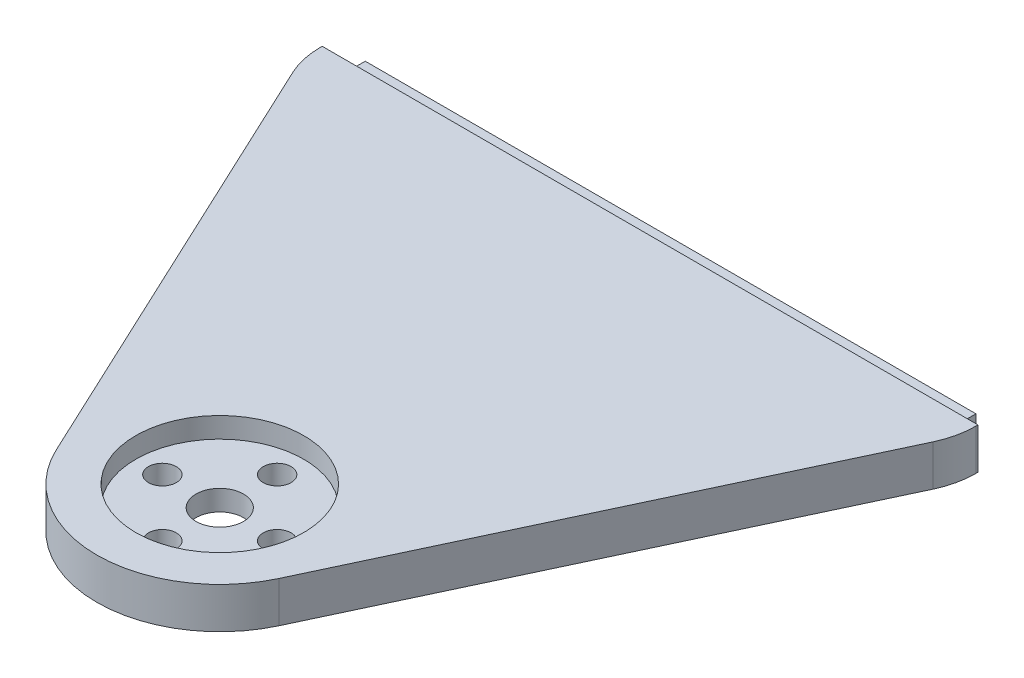
ISO-10303-21;
HEADER;
FILE_DESCRIPTION(('STEP AP214'),'2;1');
FILE_NAME('part.step','',(''),(''),'','','');
FILE_SCHEMA(('AUTOMOTIVE_DESIGN { 1 0 10303 214 1 1 1 1 }'));
ENDSEC;
DATA;
#1=APPLICATION_CONTEXT('core data for automotive mechanical design processes');
#2=APPLICATION_PROTOCOL_DEFINITION('international standard','automotive_design',2000,#1);
#3=PRODUCT_CONTEXT('',#1,'mechanical');
#4=PRODUCT('Part','Part','',(#3));
#5=PRODUCT_RELATED_PRODUCT_CATEGORY('part','',(#4));
#6=PRODUCT_DEFINITION_FORMATION('','',#4);
#7=PRODUCT_DEFINITION_CONTEXT('part definition',#1,'design');
#8=PRODUCT_DEFINITION('design','',#6,#7);
#9=PRODUCT_DEFINITION_SHAPE('','',#8);
#10=(LENGTH_UNIT() NAMED_UNIT(*) SI_UNIT(.MILLI.,.METRE.));
#11=(NAMED_UNIT(*) PLANE_ANGLE_UNIT() SI_UNIT($,.RADIAN.));
#12=(NAMED_UNIT(*) SI_UNIT($,.STERADIAN.) SOLID_ANGLE_UNIT());
#13=UNCERTAINTY_MEASURE_WITH_UNIT(LENGTH_MEASURE(1.E-05),#10,'distance_accuracy_value','');
#14=(GEOMETRIC_REPRESENTATION_CONTEXT(3) GLOBAL_UNCERTAINTY_ASSIGNED_CONTEXT((#13)) GLOBAL_UNIT_ASSIGNED_CONTEXT((#10,
#11,#12)) REPRESENTATION_CONTEXT('',''));
#15=CARTESIAN_POINT('',(0.,0.,0.));
#16=DIRECTION('',(0.,0.,1.));
#17=DIRECTION('',(1.,0.,0.));
#18=AXIS2_PLACEMENT_3D('',#15,#16,#17);
#19=CARTESIAN_POINT('',(0.,5.,50.));
#20=DIRECTION('',(0.,-1.,0.));
#21=DIRECTION('',(0.,0.,-1.));
#22=AXIS2_PLACEMENT_3D('',#19,#20,#21);
#23=CYLINDRICAL_SURFACE('',#22,2.9);
#24=CARTESIAN_POINT('',(0.,0.,50.));
#25=DIRECTION('',(0.,-1.,0.));
#26=DIRECTION('',(0.,0.,-1.));
#27=AXIS2_PLACEMENT_3D('',#24,#25,#26);
#28=CIRCLE('',#27,2.9);
#29=CARTESIAN_POINT('',(0.,0.,47.1));
#30=VERTEX_POINT('',#29);
#31=EDGE_CURVE('E165',#30,#30,#28,.T.);
#32=ORIENTED_EDGE('',*,*,#31,.T.);
#33=EDGE_LOOP('',(#32));
#34=FACE_BOUND('',#33,.T.);
#35=CARTESIAN_POINT('',(0.,2.5,50.));
#36=DIRECTION('',(0.,1.,0.));
#37=DIRECTION('',(0.,0.,1.));
#38=AXIS2_PLACEMENT_3D('',#35,#36,#37);
#39=CIRCLE('',#38,2.9);
#40=CARTESIAN_POINT('',(0.,2.5,52.9));
#41=VERTEX_POINT('',#40);
#42=EDGE_CURVE('E413',#41,#41,#39,.F.);
#43=ORIENTED_EDGE('',*,*,#42,.F.);
#44=EDGE_LOOP('',(#43));
#45=FACE_BOUND('',#44,.T.);
#46=ADVANCED_FACE('F39',(#34,#45),#23,.F.);
#47=CARTESIAN_POINT('',(0.,0.,57.));
#48=DIRECTION('',(0.,1.,0.));
#49=DIRECTION('',(0.,0.,1.));
#50=AXIS2_PLACEMENT_3D('',#47,#48,#49);
#51=CYLINDRICAL_SURFACE('',#50,1.7);
#52=CARTESIAN_POINT('',(0.,0.,57.));
#53=DIRECTION('',(0.,1.,0.));
#54=DIRECTION('',(0.,0.,1.));
#55=AXIS2_PLACEMENT_3D('',#52,#53,#54);
#56=CIRCLE('',#55,1.7);
#57=CARTESIAN_POINT('',(0.,0.,58.7));
#58=VERTEX_POINT('',#57);
#59=EDGE_CURVE('E425',#58,#58,#56,.T.);
#60=ORIENTED_EDGE('',*,*,#59,.F.);
#61=EDGE_LOOP('',(#60));
#62=FACE_BOUND('',#61,.T.);
#63=CARTESIAN_POINT('',(0.,2.5,57.));
#64=DIRECTION('',(0.,1.,0.));
#65=DIRECTION('',(0.,0.,1.));
#66=AXIS2_PLACEMENT_3D('',#63,#64,#65);
#67=CIRCLE('',#66,1.7);
#68=CARTESIAN_POINT('',(0.,2.5,58.7));
#69=VERTEX_POINT('',#68);
#70=EDGE_CURVE('E415',#69,#69,#67,.F.);
#71=ORIENTED_EDGE('',*,*,#70,.F.);
#72=EDGE_LOOP('',(#71));
#73=FACE_BOUND('',#72,.T.);
#74=ADVANCED_FACE('F271',(#62,#73),#51,.F.);
#75=CARTESIAN_POINT('',(7.,0.,50.0000000000001));
#76=DIRECTION('',(0.,1.,0.));
#77=DIRECTION('',(0.,0.,1.));
#78=AXIS2_PLACEMENT_3D('',#75,#76,#77);
#79=CYLINDRICAL_SURFACE('',#78,1.7);
#80=CARTESIAN_POINT('',(7.,0.,50.0000000000001));
#81=DIRECTION('',(0.,1.,0.));
#82=DIRECTION('',(1.,0.,0.));
#83=AXIS2_PLACEMENT_3D('',#80,#81,#82);
#84=CIRCLE('',#83,1.7);
#85=CARTESIAN_POINT('',(8.7,0.,50.0000000000001));
#86=VERTEX_POINT('',#85);
#87=EDGE_CURVE('E416',#86,#86,#84,.T.);
#88=ORIENTED_EDGE('',*,*,#87,.F.);
#89=EDGE_LOOP('',(#88));
#90=FACE_BOUND('',#89,.T.);
#91=CARTESIAN_POINT('',(7.,2.5,50.0000000000001));
#92=DIRECTION('',(0.,1.,0.));
#93=DIRECTION('',(0.,0.,1.));
#94=AXIS2_PLACEMENT_3D('',#91,#92,#93);
#95=CIRCLE('',#94,1.7);
#96=CARTESIAN_POINT('',(7.,2.5,51.7000000000001));
#97=VERTEX_POINT('',#96);
#98=EDGE_CURVE('E408',#97,#97,#95,.F.);
#99=ORIENTED_EDGE('',*,*,#98,.F.);
#100=EDGE_LOOP('',(#99));
#101=FACE_BOUND('',#100,.T.);
#102=ADVANCED_FACE('F280',(#90,#101),#79,.F.);
#103=CARTESIAN_POINT('',(0.,0.,43.));
#104=DIRECTION('',(0.,1.,0.));
#105=DIRECTION('',(0.,0.,1.));
#106=AXIS2_PLACEMENT_3D('',#103,#104,#105);
#107=CYLINDRICAL_SURFACE('',#106,1.7);
#108=CARTESIAN_POINT('',(0.,0.,43.));
#109=DIRECTION('',(0.,1.,0.));
#110=DIRECTION('',(0.,0.,-1.));
#111=AXIS2_PLACEMENT_3D('',#108,#109,#110);
#112=CIRCLE('',#111,1.7);
#113=CARTESIAN_POINT('',(0.,0.,41.3));
#114=VERTEX_POINT('',#113);
#115=EDGE_CURVE('E421',#114,#114,#112,.T.);
#116=ORIENTED_EDGE('',*,*,#115,.F.);
#117=EDGE_LOOP('',(#116));
#118=FACE_BOUND('',#117,.T.);
#119=CARTESIAN_POINT('',(0.,2.5,43.));
#120=DIRECTION('',(0.,1.,0.));
#121=DIRECTION('',(0.,0.,1.));
#122=AXIS2_PLACEMENT_3D('',#119,#120,#121);
#123=CIRCLE('',#122,1.7);
#124=CARTESIAN_POINT('',(0.,2.5,44.7));
#125=VERTEX_POINT('',#124);
#126=EDGE_CURVE('E406',#125,#125,#123,.F.);
#127=ORIENTED_EDGE('',*,*,#126,.F.);
#128=EDGE_LOOP('',(#127));
#129=FACE_BOUND('',#128,.T.);
#130=ADVANCED_FACE('F353',(#118,#129),#107,.F.);
#131=CARTESIAN_POINT('',(-7.,0.,50.));
#132=DIRECTION('',(0.,1.,0.));
#133=DIRECTION('',(0.,0.,1.));
#134=AXIS2_PLACEMENT_3D('',#131,#132,#133);
#135=CYLINDRICAL_SURFACE('',#134,1.7);
#136=CARTESIAN_POINT('',(-7.,0.,50.));
#137=DIRECTION('',(0.,1.,0.));
#138=DIRECTION('',(-1.,0.,0.));
#139=AXIS2_PLACEMENT_3D('',#136,#137,#138);
#140=CIRCLE('',#139,1.7);
#141=CARTESIAN_POINT('',(-8.7,0.,50.));
#142=VERTEX_POINT('',#141);
#143=EDGE_CURVE('E420',#142,#142,#140,.T.);
#144=ORIENTED_EDGE('',*,*,#143,.F.);
#145=EDGE_LOOP('',(#144));
#146=FACE_BOUND('',#145,.T.);
#147=CARTESIAN_POINT('',(-7.,2.5,50.));
#148=DIRECTION('',(0.,1.,0.));
#149=DIRECTION('',(0.,0.,1.));
#150=AXIS2_PLACEMENT_3D('',#147,#148,#149);
#151=CIRCLE('',#150,1.7);
#152=CARTESIAN_POINT('',(-7.,2.5,51.7));
#153=VERTEX_POINT('',#152);
#154=EDGE_CURVE('E43',#153,#153,#151,.F.);
#155=ORIENTED_EDGE('',*,*,#154,.F.);
#156=EDGE_LOOP('',(#155));
#157=FACE_BOUND('',#156,.T.);
#158=ADVANCED_FACE('F309',(#146,#157),#135,.F.);
#159=CARTESIAN_POINT('',(0.,0.,50.));
#160=DIRECTION('',(0.,1.,0.));
#161=DIRECTION('',(0.,0.,1.));
#162=AXIS2_PLACEMENT_3D('',#159,#160,#161);
#163=PLANE('',#162);
#164=ORIENTED_EDGE('',*,*,#143,.T.);
#165=EDGE_LOOP('',(#164));
#166=FACE_BOUND('',#165,.T.);
#167=ORIENTED_EDGE('',*,*,#115,.T.);
#168=EDGE_LOOP('',(#167));
#169=FACE_BOUND('',#168,.T.);
#170=ORIENTED_EDGE('',*,*,#87,.T.);
#171=EDGE_LOOP('',(#170));
#172=FACE_BOUND('',#171,.T.);
#173=ORIENTED_EDGE('',*,*,#59,.T.);
#174=EDGE_LOOP('',(#173));
#175=FACE_BOUND('',#174,.T.);
#176=ORIENTED_EDGE('',*,*,#31,.F.);
#177=EDGE_LOOP('',(#176));
#178=FACE_BOUND('',#177,.T.);
#179=DIRECTION('',(0.424385346243353,0.,0.905481682804191));
#180=VECTOR('',#179,1.);
#181=CARTESIAN_POINT('',(-40.,0.,0.));
#182=LINE('',#181,#180);
#183=CARTESIAN_POINT('',(-39.0548168280419,0.,2.0166720097165));
#184=VERTEX_POINT('',#183);
#185=CARTESIAN_POINT('',(-13.5822252420629,0.,56.3657801936503));
#186=VERTEX_POINT('',#185);
#187=EDGE_CURVE('E200',#184,#186,#182,.T.);
#188=ORIENTED_EDGE('',*,*,#187,.F.);
#189=CARTESIAN_POINT('',(-30.,0.,-2.22718145271703));
#190=DIRECTION('',(0.,1.,0.));
#191=DIRECTION('',(0.,0.,1.));
#192=AXIS2_PLACEMENT_3D('',#189,#190,#191);
#193=CIRCLE('',#192,10.);
#194=CARTESIAN_POINT('',(-40.,0.,-2.22718145271703));
#195=VERTEX_POINT('',#194);
#196=EDGE_CURVE('E219',#184,#195,#193,.F.);
#197=ORIENTED_EDGE('',*,*,#196,.T.);
#198=DIRECTION('',(0.,0.,1.));
#199=VECTOR('',#198,1.);
#200=CARTESIAN_POINT('',(-40.,0.,-5.));
#201=LINE('',#200,#199);
#202=CARTESIAN_POINT('',(-40.,0.,-2.5));
#203=VERTEX_POINT('',#202);
#204=EDGE_CURVE('E188',#203,#195,#201,.T.);
#205=ORIENTED_EDGE('',*,*,#204,.F.);
#206=DIRECTION('',(-1.,0.,0.));
#207=VECTOR('',#206,1.);
#208=CARTESIAN_POINT('',(40.,0.,-2.5));
#209=LINE('',#208,#207);
#210=CARTESIAN_POINT('',(40.,0.,-2.5));
#211=VERTEX_POINT('',#210);
#212=EDGE_CURVE('E179',#211,#203,#209,.T.);
#213=ORIENTED_EDGE('',*,*,#212,.F.);
#214=DIRECTION('',(0.,0.,1.));
#215=VECTOR('',#214,1.);
#216=CARTESIAN_POINT('',(40.,0.,-5.));
#217=LINE('',#216,#215);
#218=CARTESIAN_POINT('',(40.,0.,-2.22718145271703));
#219=VERTEX_POINT('',#218);
#220=EDGE_CURVE('E195',#211,#219,#217,.T.);
#221=ORIENTED_EDGE('',*,*,#220,.T.);
#222=CARTESIAN_POINT('',(30.,0.,-2.22718145271703));
#223=DIRECTION('',(0.,1.,0.));
#224=DIRECTION('',(0.,0.,1.));
#225=AXIS2_PLACEMENT_3D('',#222,#223,#224);
#226=CIRCLE('',#225,10.);
#227=CARTESIAN_POINT('',(39.0548168280419,0.,2.0166720097165));
#228=VERTEX_POINT('',#227);
#229=EDGE_CURVE('E217',#219,#228,#226,.F.);
#230=ORIENTED_EDGE('',*,*,#229,.T.);
#231=DIRECTION('',(-0.424385346243353,0.,0.905481682804191));
#232=VECTOR('',#231,1.);
#233=CARTESIAN_POINT('',(40.,0.,0.));
#234=LINE('',#233,#232);
#235=CARTESIAN_POINT('',(13.5822252420629,0.,56.3657801936503));
#236=VERTEX_POINT('',#235);
#237=EDGE_CURVE('E193',#228,#236,#234,.T.);
#238=ORIENTED_EDGE('',*,*,#237,.T.);
#239=CARTESIAN_POINT('',(0.,0.,50.));
#240=DIRECTION('',(0.,1.,0.));
#241=DIRECTION('',(0.,0.,1.));
#242=AXIS2_PLACEMENT_3D('',#239,#240,#241);
#243=CIRCLE('',#242,15.);
#244=EDGE_CURVE('E206',#186,#236,#243,.T.);
#245=ORIENTED_EDGE('',*,*,#244,.F.);
#246=EDGE_LOOP('',(#188,#197,#205,#213,#221,#230,#238,#245));
#247=FACE_BOUND('',#246,.T.);
#248=ADVANCED_FACE('F240',(#166,#169,#172,#175,#178,#247),#163,.F.);
#249=CARTESIAN_POINT('',(40.,5.,-5.));
#250=DIRECTION('',(-1.,0.,0.));
#251=DIRECTION('',(0.,0.,1.));
#252=AXIS2_PLACEMENT_3D('',#249,#250,#251);
#253=PLANE('',#252);
#254=DIRECTION('',(0.,0.,1.));
#255=VECTOR('',#254,1.);
#256=CARTESIAN_POINT('',(40.,5.,-5.));
#257=LINE('',#256,#255);
#258=CARTESIAN_POINT('',(40.,5.,-2.5));
#259=VERTEX_POINT('',#258);
#260=CARTESIAN_POINT('',(40.,5.,-2.22718145271703));
#261=VERTEX_POINT('',#260);
#262=EDGE_CURVE('E184',#259,#261,#257,.T.);
#263=ORIENTED_EDGE('',*,*,#262,.T.);
#264=DIRECTION('',(0.,-1.,0.));
#265=VECTOR('',#264,1.);
#266=CARTESIAN_POINT('',(40.,0.,-2.22718145271703));
#267=LINE('',#266,#265);
#268=EDGE_CURVE('E48',#261,#219,#267,.T.);
#269=ORIENTED_EDGE('',*,*,#268,.T.);
#270=ORIENTED_EDGE('',*,*,#220,.F.);
#271=DIRECTION('',(0.,-1.,0.));
#272=VECTOR('',#271,1.);
#273=CARTESIAN_POINT('',(40.,5.,-2.5));
#274=LINE('',#273,#272);
#275=EDGE_CURVE('E172',#259,#211,#274,.T.);
#276=ORIENTED_EDGE('',*,*,#275,.F.);
#277=EDGE_LOOP('',(#263,#269,#270,#276));
#278=FACE_BOUND('',#277,.T.);
#279=ADVANCED_FACE('F232',(#278),#253,.F.);
#280=CARTESIAN_POINT('',(-40.,5.,0.));
#281=DIRECTION('',(0.905481682804191,0.,-0.424385346243353));
#282=DIRECTION('',(-0.424385346243353,0.,-0.905481682804191));
#283=AXIS2_PLACEMENT_3D('',#280,#281,#282);
#284=PLANE('',#283);
#285=DIRECTION('',(0.424385346243353,0.,0.905481682804191));
#286=VECTOR('',#285,1.);
#287=CARTESIAN_POINT('',(-40.,5.,0.));
#288=LINE('',#287,#286);
#289=CARTESIAN_POINT('',(-39.0548168280419,5.,2.0166720097165));
#290=VERTEX_POINT('',#289);
#291=CARTESIAN_POINT('',(-13.5822252420629,5.,56.3657801936503));
#292=VERTEX_POINT('',#291);
#293=EDGE_CURVE('E205',#290,#292,#288,.T.);
#294=ORIENTED_EDGE('',*,*,#293,.F.);
#295=DIRECTION('',(0.,-1.,0.));
#296=VECTOR('',#295,1.);
#297=CARTESIAN_POINT('',(-39.0548168280419,0.,2.0166720097165));
#298=LINE('',#297,#296);
#299=EDGE_CURVE('E213',#290,#184,#298,.T.);
#300=ORIENTED_EDGE('',*,*,#299,.T.);
#301=ORIENTED_EDGE('',*,*,#187,.T.);
#302=DIRECTION('',(0.,-1.,0.));
#303=VECTOR('',#302,1.);
#304=CARTESIAN_POINT('',(-13.5822252420629,5.,56.3657801936503));
#305=LINE('',#304,#303);
#306=EDGE_CURVE('E209',#292,#186,#305,.T.);
#307=ORIENTED_EDGE('',*,*,#306,.F.);
#308=EDGE_LOOP('',(#294,#300,#301,#307));
#309=FACE_BOUND('',#308,.T.);
#310=ADVANCED_FACE('F252',(#309),#284,.F.);
#311=CARTESIAN_POINT('',(0.,5.,50.));
#312=DIRECTION('',(0.,-1.,0.));
#313=DIRECTION('',(0.,0.,-1.));
#314=AXIS2_PLACEMENT_3D('',#311,#312,#313);
#315=CYLINDRICAL_SURFACE('',#314,15.);
#316=ORIENTED_EDGE('',*,*,#244,.T.);
#317=DIRECTION('',(0.,-1.,0.));
#318=VECTOR('',#317,1.);
#319=CARTESIAN_POINT('',(13.5822252420629,5.,56.3657801936503));
#320=LINE('',#319,#318);
#321=CARTESIAN_POINT('',(13.5822252420629,5.,56.3657801936503));
#322=VERTEX_POINT('',#321);
#323=EDGE_CURVE('E204',#322,#236,#320,.T.);
#324=ORIENTED_EDGE('',*,*,#323,.F.);
#325=CARTESIAN_POINT('',(0.,5.,50.));
#326=DIRECTION('',(0.,1.,0.));
#327=DIRECTION('',(0.,0.,1.));
#328=AXIS2_PLACEMENT_3D('',#325,#326,#327);
#329=CIRCLE('',#328,15.);
#330=EDGE_CURVE('E196',#292,#322,#329,.T.);
#331=ORIENTED_EDGE('',*,*,#330,.F.);
#332=ORIENTED_EDGE('',*,*,#306,.T.);
#333=EDGE_LOOP('',(#316,#324,#331,#332));
#334=FACE_BOUND('',#333,.T.);
#335=ADVANCED_FACE('F260',(#334),#315,.T.);
#336=CARTESIAN_POINT('',(40.,5.,0.));
#337=DIRECTION('',(0.905481682804191,0.,0.424385346243353));
#338=DIRECTION('',(0.424385346243353,0.,-0.905481682804191));
#339=AXIS2_PLACEMENT_3D('',#336,#337,#338);
#340=PLANE('',#339);
#341=ORIENTED_EDGE('',*,*,#237,.F.);
#342=DIRECTION('',(0.,-1.,0.));
#343=VECTOR('',#342,1.);
#344=CARTESIAN_POINT('',(39.0548168280419,5.,2.0166720097165));
#345=LINE('',#344,#343);
#346=CARTESIAN_POINT('',(39.0548168280419,5.,2.0166720097165));
#347=VERTEX_POINT('',#346);
#348=EDGE_CURVE('E11',#228,#347,#345,.F.);
#349=ORIENTED_EDGE('',*,*,#348,.T.);
#350=DIRECTION('',(-0.424385346243353,0.,0.905481682804191));
#351=VECTOR('',#350,1.);
#352=CARTESIAN_POINT('',(40.,5.,0.));
#353=LINE('',#352,#351);
#354=EDGE_CURVE('E198',#347,#322,#353,.T.);
#355=ORIENTED_EDGE('',*,*,#354,.T.);
#356=ORIENTED_EDGE('',*,*,#323,.T.);
#357=EDGE_LOOP('',(#341,#349,#355,#356));
#358=FACE_BOUND('',#357,.T.);
#359=ADVANCED_FACE('F307',(#358),#340,.T.);
#360=CARTESIAN_POINT('',(0.,5.,50.));
#361=DIRECTION('',(0.,1.,0.));
#362=DIRECTION('',(0.,0.,1.));
#363=AXIS2_PLACEMENT_3D('',#360,#361,#362);
#364=PLANE('',#363);
#365=CARTESIAN_POINT('',(0.,5.,50.));
#366=DIRECTION('',(0.,1.,0.));
#367=DIRECTION('',(0.,0.,1.));
#368=AXIS2_PLACEMENT_3D('',#365,#366,#367);
#369=CIRCLE('',#368,10.25);
#370=CARTESIAN_POINT('',(0.,5.,60.25));
#371=VERTEX_POINT('',#370);
#372=EDGE_CURVE('E405',#371,#371,#369,.T.);
#373=ORIENTED_EDGE('',*,*,#372,.F.);
#374=EDGE_LOOP('',(#373));
#375=FACE_BOUND('',#374,.T.);
#376=DIRECTION('',(0.,0.,1.));
#377=VECTOR('',#376,1.);
#378=CARTESIAN_POINT('',(-40.,5.,-5.));
#379=LINE('',#378,#377);
#380=CARTESIAN_POINT('',(-40.,5.,-2.5));
#381=VERTEX_POINT('',#380);
#382=CARTESIAN_POINT('',(-40.,5.,-2.22718145271703));
#383=VERTEX_POINT('',#382);
#384=EDGE_CURVE('E186',#381,#383,#379,.T.);
#385=ORIENTED_EDGE('',*,*,#384,.T.);
#386=CARTESIAN_POINT('',(-30.,5.,-2.22718145271703));
#387=DIRECTION('',(0.,1.,0.));
#388=DIRECTION('',(0.,0.,1.));
#389=AXIS2_PLACEMENT_3D('',#386,#387,#388);
#390=CIRCLE('',#389,10.);
#391=EDGE_CURVE('E223',#383,#290,#390,.T.);
#392=ORIENTED_EDGE('',*,*,#391,.T.);
#393=ORIENTED_EDGE('',*,*,#293,.T.);
#394=ORIENTED_EDGE('',*,*,#330,.T.);
#395=ORIENTED_EDGE('',*,*,#354,.F.);
#396=CARTESIAN_POINT('',(30.,5.,-2.22718145271703));
#397=DIRECTION('',(0.,1.,0.));
#398=DIRECTION('',(0.,0.,1.));
#399=AXIS2_PLACEMENT_3D('',#396,#397,#398);
#400=CIRCLE('',#399,10.);
#401=EDGE_CURVE('E54',#347,#261,#400,.T.);
#402=ORIENTED_EDGE('',*,*,#401,.T.);
#403=ORIENTED_EDGE('',*,*,#262,.F.);
#404=DIRECTION('',(1.,0.,0.));
#405=VECTOR('',#404,1.);
#406=CARTESIAN_POINT('',(40.,5.,-2.5));
#407=LINE('',#406,#405);
#408=EDGE_CURVE('E185',#381,#259,#407,.T.);
#409=ORIENTED_EDGE('',*,*,#408,.F.);
#410=EDGE_LOOP('',(#385,#392,#393,#394,#395,#402,#403,#409));
#411=FACE_BOUND('',#410,.T.);
#412=ADVANCED_FACE('F247',(#375,#411),#364,.T.);
#413=CARTESIAN_POINT('',(-40.,5.,-5.));
#414=DIRECTION('',(-1.,0.,0.));
#415=DIRECTION('',(0.,0.,1.));
#416=AXIS2_PLACEMENT_3D('',#413,#414,#415);
#417=PLANE('',#416);
#418=ORIENTED_EDGE('',*,*,#204,.T.);
#419=DIRECTION('',(0.,-1.,0.));
#420=VECTOR('',#419,1.);
#421=CARTESIAN_POINT('',(-40.,5.,-2.22718145271703));
#422=LINE('',#421,#420);
#423=EDGE_CURVE('E225',#195,#383,#422,.F.);
#424=ORIENTED_EDGE('',*,*,#423,.T.);
#425=ORIENTED_EDGE('',*,*,#384,.F.);
#426=DIRECTION('',(0.,1.,0.));
#427=VECTOR('',#426,1.);
#428=CARTESIAN_POINT('',(-40.,5.,-2.5));
#429=LINE('',#428,#427);
#430=EDGE_CURVE('E178',#203,#381,#429,.T.);
#431=ORIENTED_EDGE('',*,*,#430,.F.);
#432=EDGE_LOOP('',(#418,#424,#425,#431));
#433=FACE_BOUND('',#432,.T.);
#434=ADVANCED_FACE('F242',(#433),#417,.T.);
#435=CARTESIAN_POINT('',(0.,0.,-2.5));
#436=DIRECTION('',(0.,0.,-1.));
#437=DIRECTION('',(-1.,0.,0.));
#438=AXIS2_PLACEMENT_3D('',#435,#436,#437);
#439=PLANE('',#438);
#440=DIRECTION('',(-1.,0.,0.));
#441=VECTOR('',#440,1.);
#442=CARTESIAN_POINT('',(37.25,1.45,-2.5));
#443=LINE('',#442,#441);
#444=CARTESIAN_POINT('',(37.25,1.45,-2.5));
#445=VERTEX_POINT('',#444);
#446=CARTESIAN_POINT('',(-37.25,1.45,-2.5));
#447=VERTEX_POINT('',#446);
#448=EDGE_CURVE('E143',#445,#447,#443,.T.);
#449=ORIENTED_EDGE('',*,*,#448,.F.);
#450=DIRECTION('',(0.,-1.,0.));
#451=VECTOR('',#450,1.);
#452=CARTESIAN_POINT('',(37.25,3.55,-2.5));
#453=LINE('',#452,#451);
#454=CARTESIAN_POINT('',(37.25,3.55,-2.5));
#455=VERTEX_POINT('',#454);
#456=EDGE_CURVE('E151',#455,#445,#453,.T.);
#457=ORIENTED_EDGE('',*,*,#456,.F.);
#458=DIRECTION('',(1.,0.,0.));
#459=VECTOR('',#458,1.);
#460=CARTESIAN_POINT('',(37.25,3.55,-2.5));
#461=LINE('',#460,#459);
#462=CARTESIAN_POINT('',(-37.25,3.55,-2.5));
#463=VERTEX_POINT('',#462);
#464=EDGE_CURVE('E132',#463,#455,#461,.T.);
#465=ORIENTED_EDGE('',*,*,#464,.F.);
#466=DIRECTION('',(0.,1.,0.));
#467=VECTOR('',#466,1.);
#468=CARTESIAN_POINT('',(-37.25,3.55,-2.5));
#469=LINE('',#468,#467);
#470=EDGE_CURVE('E146',#447,#463,#469,.T.);
#471=ORIENTED_EDGE('',*,*,#470,.F.);
#472=EDGE_LOOP('',(#449,#457,#465,#471));
#473=FACE_BOUND('',#472,.T.);
#474=ORIENTED_EDGE('',*,*,#275,.T.);
#475=ORIENTED_EDGE('',*,*,#212,.T.);
#476=ORIENTED_EDGE('',*,*,#430,.T.);
#477=ORIENTED_EDGE('',*,*,#408,.T.);
#478=EDGE_LOOP('',(#474,#475,#476,#477));
#479=FACE_BOUND('',#478,.T.);
#480=ADVANCED_FACE('F148',(#473,#479),#439,.T.);
#481=CARTESIAN_POINT('',(-37.25,3.55,-2.5));
#482=DIRECTION('',(-1.,0.,0.));
#483=DIRECTION('',(0.,0.,1.));
#484=AXIS2_PLACEMENT_3D('',#481,#482,#483);
#485=PLANE('',#484);
#486=DIRECTION('',(0.,1.,0.));
#487=VECTOR('',#486,1.);
#488=CARTESIAN_POINT('',(-37.25,3.55,-5.));
#489=LINE('',#488,#487);
#490=CARTESIAN_POINT('',(-37.25,1.45,-5.));
#491=VERTEX_POINT('',#490);
#492=CARTESIAN_POINT('',(-37.25,3.55,-5.));
#493=VERTEX_POINT('',#492);
#494=EDGE_CURVE('E170',#491,#493,#489,.T.);
#495=ORIENTED_EDGE('',*,*,#494,.F.);
#496=DIRECTION('',(0.,0.,-1.));
#497=VECTOR('',#496,1.);
#498=CARTESIAN_POINT('',(-37.25,1.45,-2.5));
#499=LINE('',#498,#497);
#500=EDGE_CURVE('E154',#447,#491,#499,.T.);
#501=ORIENTED_EDGE('',*,*,#500,.F.);
#502=ORIENTED_EDGE('',*,*,#470,.T.);
#503=DIRECTION('',(0.,0.,-1.));
#504=VECTOR('',#503,1.);
#505=CARTESIAN_POINT('',(-37.25,3.55,-2.5));
#506=LINE('',#505,#504);
#507=EDGE_CURVE('E129',#463,#493,#506,.T.);
#508=ORIENTED_EDGE('',*,*,#507,.T.);
#509=EDGE_LOOP('',(#495,#501,#502,#508));
#510=FACE_BOUND('',#509,.T.);
#511=ADVANCED_FACE('F152',(#510),#485,.T.);
#512=CARTESIAN_POINT('',(37.25,1.45,-2.5));
#513=DIRECTION('',(0.,-1.,0.));
#514=DIRECTION('',(0.,0.,-1.));
#515=AXIS2_PLACEMENT_3D('',#512,#513,#514);
#516=PLANE('',#515);
#517=DIRECTION('',(-1.,0.,0.));
#518=VECTOR('',#517,1.);
#519=CARTESIAN_POINT('',(37.25,1.45,-5.));
#520=LINE('',#519,#518);
#521=CARTESIAN_POINT('',(37.25,1.45,-5.));
#522=VERTEX_POINT('',#521);
#523=EDGE_CURVE('E156',#522,#491,#520,.T.);
#524=ORIENTED_EDGE('',*,*,#523,.F.);
#525=DIRECTION('',(0.,0.,-1.));
#526=VECTOR('',#525,1.);
#527=CARTESIAN_POINT('',(37.25,1.45,-2.5));
#528=LINE('',#527,#526);
#529=EDGE_CURVE('E173',#445,#522,#528,.T.);
#530=ORIENTED_EDGE('',*,*,#529,.F.);
#531=ORIENTED_EDGE('',*,*,#448,.T.);
#532=ORIENTED_EDGE('',*,*,#500,.T.);
#533=EDGE_LOOP('',(#524,#530,#531,#532));
#534=FACE_BOUND('',#533,.T.);
#535=ADVANCED_FACE('F283',(#534),#516,.T.);
#536=CARTESIAN_POINT('',(37.25,3.55,-2.5));
#537=DIRECTION('',(1.,0.,0.));
#538=DIRECTION('',(0.,0.,-1.));
#539=AXIS2_PLACEMENT_3D('',#536,#537,#538);
#540=PLANE('',#539);
#541=DIRECTION('',(0.,-1.,0.));
#542=VECTOR('',#541,1.);
#543=CARTESIAN_POINT('',(37.25,3.55,-5.));
#544=LINE('',#543,#542);
#545=CARTESIAN_POINT('',(37.25,3.55,-5.));
#546=VERTEX_POINT('',#545);
#547=EDGE_CURVE('E157',#546,#522,#544,.T.);
#548=ORIENTED_EDGE('',*,*,#547,.F.);
#549=DIRECTION('',(0.,0.,-1.));
#550=VECTOR('',#549,1.);
#551=CARTESIAN_POINT('',(37.25,3.55,-2.5));
#552=LINE('',#551,#550);
#553=EDGE_CURVE('E138',#455,#546,#552,.T.);
#554=ORIENTED_EDGE('',*,*,#553,.F.);
#555=ORIENTED_EDGE('',*,*,#456,.T.);
#556=ORIENTED_EDGE('',*,*,#529,.T.);
#557=EDGE_LOOP('',(#548,#554,#555,#556));
#558=FACE_BOUND('',#557,.T.);
#559=ADVANCED_FACE('F290',(#558),#540,.T.);
#560=CARTESIAN_POINT('',(37.25,3.55,-2.5));
#561=DIRECTION('',(0.,1.,0.));
#562=DIRECTION('',(0.,0.,1.));
#563=AXIS2_PLACEMENT_3D('',#560,#561,#562);
#564=PLANE('',#563);
#565=DIRECTION('',(1.,0.,0.));
#566=VECTOR('',#565,1.);
#567=CARTESIAN_POINT('',(37.25,3.55,-5.));
#568=LINE('',#567,#566);
#569=EDGE_CURVE('E134',#493,#546,#568,.T.);
#570=ORIENTED_EDGE('',*,*,#569,.F.);
#571=ORIENTED_EDGE('',*,*,#507,.F.);
#572=ORIENTED_EDGE('',*,*,#464,.T.);
#573=ORIENTED_EDGE('',*,*,#553,.T.);
#574=EDGE_LOOP('',(#570,#571,#572,#573));
#575=FACE_BOUND('',#574,.T.);
#576=ADVANCED_FACE('F131',(#575),#564,.T.);
#577=CARTESIAN_POINT('',(0.,0.,-5.));
#578=DIRECTION('',(0.,0.,-1.));
#579=DIRECTION('',(-1.,0.,0.));
#580=AXIS2_PLACEMENT_3D('',#577,#578,#579);
#581=PLANE('',#580);
#582=ORIENTED_EDGE('',*,*,#523,.T.);
#583=ORIENTED_EDGE('',*,*,#494,.T.);
#584=ORIENTED_EDGE('',*,*,#569,.T.);
#585=ORIENTED_EDGE('',*,*,#547,.T.);
#586=EDGE_LOOP('',(#582,#583,#584,#585));
#587=FACE_BOUND('',#586,.T.);
#588=ADVANCED_FACE('F267',(#587),#581,.T.);
#589=CARTESIAN_POINT('',(-30.,5.,-2.22718145271703));
#590=DIRECTION('',(0.,1.,0.));
#591=DIRECTION('',(0.,0.,1.));
#592=AXIS2_PLACEMENT_3D('',#589,#590,#591);
#593=CYLINDRICAL_SURFACE('',#592,10.);
#594=ORIENTED_EDGE('',*,*,#391,.F.);
#595=ORIENTED_EDGE('',*,*,#423,.F.);
#596=ORIENTED_EDGE('',*,*,#196,.F.);
#597=ORIENTED_EDGE('',*,*,#299,.F.);
#598=EDGE_LOOP('',(#594,#595,#596,#597));
#599=FACE_BOUND('',#598,.T.);
#600=ADVANCED_FACE('F248',(#599),#593,.T.);
#601=CARTESIAN_POINT('',(30.,5.,-2.22718145271703));
#602=DIRECTION('',(0.,1.,0.));
#603=DIRECTION('',(0.,0.,1.));
#604=AXIS2_PLACEMENT_3D('',#601,#602,#603);
#605=CYLINDRICAL_SURFACE('',#604,10.);
#606=ORIENTED_EDGE('',*,*,#401,.F.);
#607=ORIENTED_EDGE('',*,*,#348,.F.);
#608=ORIENTED_EDGE('',*,*,#229,.F.);
#609=ORIENTED_EDGE('',*,*,#268,.F.);
#610=EDGE_LOOP('',(#606,#607,#608,#609));
#611=FACE_BOUND('',#610,.T.);
#612=ADVANCED_FACE('F41',(#611),#605,.T.);
#613=CARTESIAN_POINT('',(0.,2.5,50.));
#614=DIRECTION('',(0.,1.,0.));
#615=DIRECTION('',(0.,0.,1.));
#616=AXIS2_PLACEMENT_3D('',#613,#614,#615);
#617=PLANE('',#616);
#618=CARTESIAN_POINT('',(0.,2.5,50.));
#619=DIRECTION('',(0.,1.,0.));
#620=DIRECTION('',(0.,0.,1.));
#621=AXIS2_PLACEMENT_3D('',#618,#619,#620);
#622=CIRCLE('',#621,10.25);
#623=CARTESIAN_POINT('',(0.,2.5,60.25));
#624=VERTEX_POINT('',#623);
#625=EDGE_CURVE('E396',#624,#624,#622,.T.);
#626=ORIENTED_EDGE('',*,*,#625,.T.);
#627=EDGE_LOOP('',(#626));
#628=FACE_BOUND('',#627,.T.);
#629=ORIENTED_EDGE('',*,*,#154,.T.);
#630=EDGE_LOOP('',(#629));
#631=FACE_BOUND('',#630,.T.);
#632=ORIENTED_EDGE('',*,*,#126,.T.);
#633=EDGE_LOOP('',(#632));
#634=FACE_BOUND('',#633,.T.);
#635=ORIENTED_EDGE('',*,*,#98,.T.);
#636=EDGE_LOOP('',(#635));
#637=FACE_BOUND('',#636,.T.);
#638=ORIENTED_EDGE('',*,*,#70,.T.);
#639=EDGE_LOOP('',(#638));
#640=FACE_BOUND('',#639,.T.);
#641=ORIENTED_EDGE('',*,*,#42,.T.);
#642=EDGE_LOOP('',(#641));
#643=FACE_BOUND('',#642,.T.);
#644=ADVANCED_FACE('F257',(#628,#631,#634,#637,#640,#643),#617,.T.);
#645=CARTESIAN_POINT('',(0.,2.5,50.));
#646=DIRECTION('',(0.,1.,0.));
#647=DIRECTION('',(0.,0.,1.));
#648=AXIS2_PLACEMENT_3D('',#645,#646,#647);
#649=CYLINDRICAL_SURFACE('',#648,10.25);
#650=ORIENTED_EDGE('',*,*,#625,.F.);
#651=EDGE_LOOP('',(#650));
#652=FACE_BOUND('',#651,.T.);
#653=ORIENTED_EDGE('',*,*,#372,.T.);
#654=EDGE_LOOP('',(#653));
#655=FACE_BOUND('',#654,.T.);
#656=ADVANCED_FACE('F266',(#652,#655),#649,.F.);
#657=CLOSED_SHELL('',(#46,#74,#102,#130,#158,#248,#279,#310,#335,#359,#412,#434,#480,#511,#535,
#559,#576,#588,#600,#612,#644,#656));
#658=MANIFOLD_SOLID_BREP('B2',#657);
#659=ADVANCED_BREP_SHAPE_REPRESENTATION('',(#18,#658),#14);
#660=SHAPE_DEFINITION_REPRESENTATION(#9,#659);
ENDSEC;
END-ISO-10303-21;
